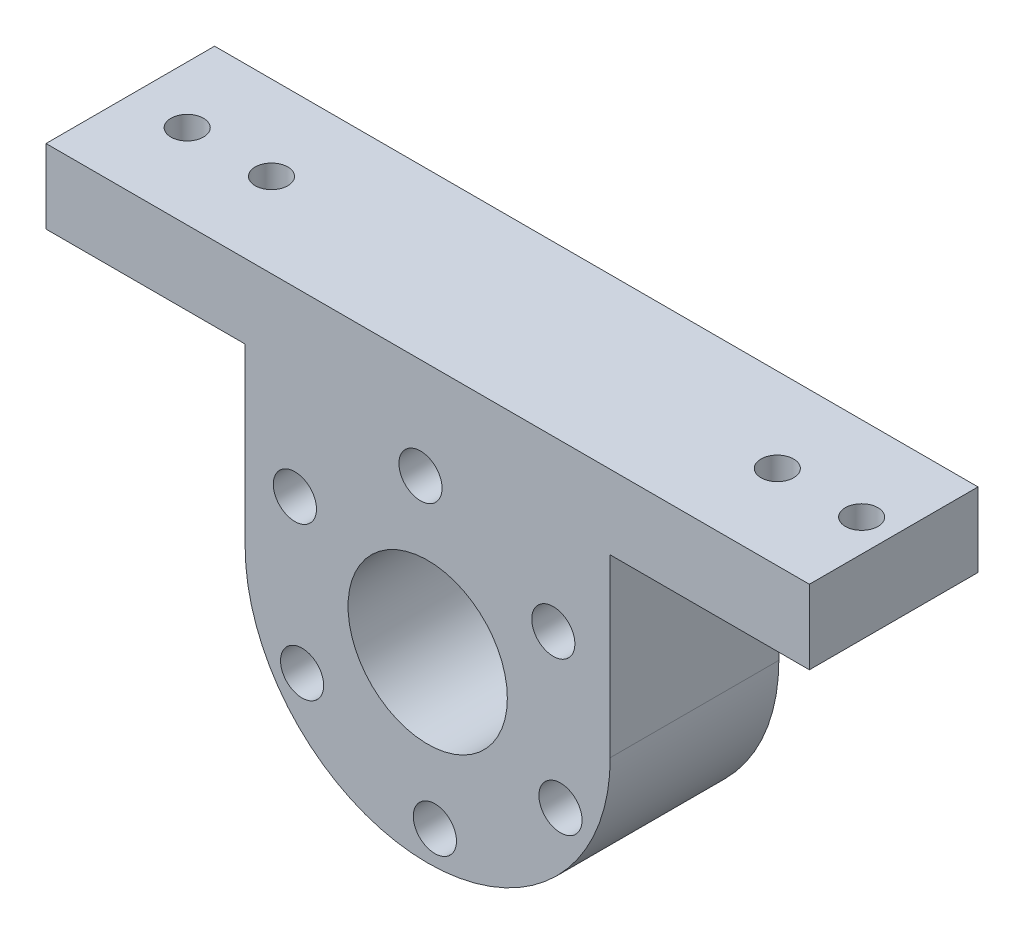
ISO-10303-21;
HEADER;
FILE_DESCRIPTION(('STEP AP214'),'2;1');
FILE_NAME('part.step','',(''),(''),'','','');
FILE_SCHEMA(('AUTOMOTIVE_DESIGN { 1 0 10303 214 1 1 1 1 }'));
ENDSEC;
DATA;
#1=APPLICATION_CONTEXT('core data for automotive mechanical design processes');
#2=APPLICATION_PROTOCOL_DEFINITION('international standard','automotive_design',2000,#1);
#3=PRODUCT_CONTEXT('',#1,'mechanical');
#4=PRODUCT('Part','Part','',(#3));
#5=PRODUCT_RELATED_PRODUCT_CATEGORY('part','',(#4));
#6=PRODUCT_DEFINITION_FORMATION('','',#4);
#7=PRODUCT_DEFINITION_CONTEXT('part definition',#1,'design');
#8=PRODUCT_DEFINITION('design','',#6,#7);
#9=PRODUCT_DEFINITION_SHAPE('','',#8);
#10=(LENGTH_UNIT() NAMED_UNIT(*) SI_UNIT(.MILLI.,.METRE.));
#11=(NAMED_UNIT(*) PLANE_ANGLE_UNIT() SI_UNIT($,.RADIAN.));
#12=(NAMED_UNIT(*) SI_UNIT($,.STERADIAN.) SOLID_ANGLE_UNIT());
#13=UNCERTAINTY_MEASURE_WITH_UNIT(LENGTH_MEASURE(1.E-05),#10,'distance_accuracy_value','');
#14=(GEOMETRIC_REPRESENTATION_CONTEXT(3) GLOBAL_UNCERTAINTY_ASSIGNED_CONTEXT((#13)) GLOBAL_UNIT_ASSIGNED_CONTEXT((#10,
#11,#12)) REPRESENTATION_CONTEXT('',''));
#15=CARTESIAN_POINT('',(0.,0.,0.));
#16=DIRECTION('',(0.,0.,1.));
#17=DIRECTION('',(1.,0.,0.));
#18=AXIS2_PLACEMENT_3D('',#15,#16,#17);
#19=CARTESIAN_POINT('',(0.,0.,25.4));
#20=DIRECTION('',(0.,1.,0.));
#21=DIRECTION('',(0.,0.,1.));
#22=AXIS2_PLACEMENT_3D('',#19,#20,#21);
#23=PLANE('',#22);
#24=CARTESIAN_POINT('',(-4.82999999999954,0.,12.7000000000003));
#25=DIRECTION('',(0.,1.,0.));
#26=DIRECTION('',(0.,0.,1.));
#27=AXIS2_PLACEMENT_3D('',#24,#25,#26);
#28=CIRCLE('',#27,2.45744999999999);
#29=CARTESIAN_POINT('',(-4.82999999999954,0.,15.1574500000003));
#30=VERTEX_POINT('',#29);
#31=EDGE_CURVE('E313',#30,#30,#28,.T.);
#32=ORIENTED_EDGE('',*,*,#31,.F.);
#33=EDGE_LOOP('',(#32));
#34=FACE_BOUND('',#33,.T.);
#35=CARTESIAN_POINT('',(-17.5299999999996,0.,12.7000000000003));
#36=DIRECTION('',(0.,1.,0.));
#37=DIRECTION('',(0.,0.,1.));
#38=AXIS2_PLACEMENT_3D('',#35,#36,#37);
#39=CIRCLE('',#38,2.45744999999999);
#40=CARTESIAN_POINT('',(-17.5299999999996,0.,15.1574500000003));
#41=VERTEX_POINT('',#40);
#42=EDGE_CURVE('E317',#41,#41,#39,.T.);
#43=ORIENTED_EDGE('',*,*,#42,.F.);
#44=EDGE_LOOP('',(#43));
#45=FACE_BOUND('',#44,.T.);
#46=CARTESIAN_POINT('',(-106.43,0.,12.7000000000003));
#47=DIRECTION('',(0.,1.,0.));
#48=DIRECTION('',(0.,0.,1.));
#49=AXIS2_PLACEMENT_3D('',#46,#47,#48);
#50=CIRCLE('',#49,2.45745);
#51=CARTESIAN_POINT('',(-106.43,0.,15.1574500000003));
#52=VERTEX_POINT('',#51);
#53=EDGE_CURVE('E312',#52,#52,#50,.T.);
#54=ORIENTED_EDGE('',*,*,#53,.F.);
#55=EDGE_LOOP('',(#54));
#56=FACE_BOUND('',#55,.T.);
#57=CARTESIAN_POINT('',(-93.7299999999995,0.,12.7000000000003));
#58=DIRECTION('',(0.,1.,0.));
#59=DIRECTION('',(0.,0.,1.));
#60=AXIS2_PLACEMENT_3D('',#57,#58,#59);
#61=CIRCLE('',#60,2.45744999999999);
#62=CARTESIAN_POINT('',(-93.7299999999995,0.,15.1574500000003));
#63=VERTEX_POINT('',#62);
#64=EDGE_CURVE('E265',#63,#63,#61,.T.);
#65=ORIENTED_EDGE('',*,*,#64,.F.);
#66=EDGE_LOOP('',(#65));
#67=FACE_BOUND('',#66,.T.);
#68=DIRECTION('',(1.,0.,0.));
#69=VECTOR('',#68,1.);
#70=CARTESIAN_POINT('',(0.,0.,0.));
#71=LINE('',#70,#69);
#72=CARTESIAN_POINT('',(-115.,0.,0.));
#73=VERTEX_POINT('',#72);
#74=CARTESIAN_POINT('',(0.,0.,0.));
#75=VERTEX_POINT('',#74);
#76=EDGE_CURVE('E190',#73,#75,#71,.T.);
#77=ORIENTED_EDGE('',*,*,#76,.F.);
#78=DIRECTION('',(0.,0.,-1.));
#79=VECTOR('',#78,1.);
#80=CARTESIAN_POINT('',(-115.,0.,25.4));
#81=LINE('',#80,#79);
#82=CARTESIAN_POINT('',(-115.,0.,25.4));
#83=VERTEX_POINT('',#82);
#84=EDGE_CURVE('E11',#83,#73,#81,.T.);
#85=ORIENTED_EDGE('',*,*,#84,.F.);
#86=DIRECTION('',(1.,0.,0.));
#87=VECTOR('',#86,1.);
#88=CARTESIAN_POINT('',(0.,0.,25.4));
#89=LINE('',#88,#87);
#90=CARTESIAN_POINT('',(0.,0.,25.4));
#91=VERTEX_POINT('',#90);
#92=EDGE_CURVE('E245',#83,#91,#89,.T.);
#93=ORIENTED_EDGE('',*,*,#92,.T.);
#94=DIRECTION('',(0.,0.,-1.));
#95=VECTOR('',#94,1.);
#96=CARTESIAN_POINT('',(0.,0.,25.4));
#97=LINE('',#96,#95);
#98=EDGE_CURVE('E110',#91,#75,#97,.T.);
#99=ORIENTED_EDGE('',*,*,#98,.T.);
#100=EDGE_LOOP('',(#77,#85,#93,#99));
#101=FACE_BOUND('',#100,.T.);
#102=ADVANCED_FACE('F50',(#34,#45,#56,#67,#101),#23,.T.);
#103=CARTESIAN_POINT('',(-115.,0.,25.4));
#104=DIRECTION('',(-1.,0.,0.));
#105=DIRECTION('',(0.,0.,1.));
#106=AXIS2_PLACEMENT_3D('',#103,#104,#105);
#107=PLANE('',#106);
#108=DIRECTION('',(0.,1.,0.));
#109=VECTOR('',#108,1.);
#110=CARTESIAN_POINT('',(-115.,0.,0.));
#111=LINE('',#110,#109);
#112=CARTESIAN_POINT('',(-115.,-11.1674868933549,0.));
#113=VERTEX_POINT('',#112);
#114=EDGE_CURVE('E194',#113,#73,#111,.T.);
#115=ORIENTED_EDGE('',*,*,#114,.F.);
#116=DIRECTION('',(0.,0.,-1.));
#117=VECTOR('',#116,1.);
#118=CARTESIAN_POINT('',(-115.,-11.1674868933549,25.4));
#119=LINE('',#118,#117);
#120=CARTESIAN_POINT('',(-115.,-11.1674868933549,25.4));
#121=VERTEX_POINT('',#120);
#122=EDGE_CURVE('E60',#121,#113,#119,.T.);
#123=ORIENTED_EDGE('',*,*,#122,.F.);
#124=DIRECTION('',(0.,1.,0.));
#125=VECTOR('',#124,1.);
#126=CARTESIAN_POINT('',(-115.,0.,25.4));
#127=LINE('',#126,#125);
#128=EDGE_CURVE('E301',#121,#83,#127,.T.);
#129=ORIENTED_EDGE('',*,*,#128,.T.);
#130=ORIENTED_EDGE('',*,*,#84,.T.);
#131=EDGE_LOOP('',(#115,#123,#129,#130));
#132=FACE_BOUND('',#131,.T.);
#133=ADVANCED_FACE('F284',(#132),#107,.T.);
#134=CARTESIAN_POINT('',(0.,-11.1674868933545,25.4));
#135=DIRECTION('',(0.,-1.,0.));
#136=DIRECTION('',(1.,0.,0.));
#137=AXIS2_PLACEMENT_3D('',#134,#135,#136);
#138=PLANE('',#137);
#139=CARTESIAN_POINT('',(-106.43,-11.1674868933549,12.7000000000003));
#140=DIRECTION('',(0.,-1.,0.));
#141=DIRECTION('',(1.,0.,0.));
#142=AXIS2_PLACEMENT_3D('',#139,#140,#141);
#143=CIRCLE('',#142,2.45745);
#144=CARTESIAN_POINT('',(-103.97255,-11.1674868933549,12.7000000000003));
#145=VERTEX_POINT('',#144);
#146=EDGE_CURVE('E53',#145,#145,#143,.T.);
#147=ORIENTED_EDGE('',*,*,#146,.F.);
#148=EDGE_LOOP('',(#147));
#149=FACE_BOUND('',#148,.T.);
#150=CARTESIAN_POINT('',(-93.7299999999995,-11.1674868933548,12.7000000000003));
#151=DIRECTION('',(0.,-1.,0.));
#152=DIRECTION('',(1.,0.,0.));
#153=AXIS2_PLACEMENT_3D('',#150,#151,#152);
#154=CIRCLE('',#153,2.45744999999999);
#155=CARTESIAN_POINT('',(-91.2725499999996,-11.1674868933548,12.7000000000003));
#156=VERTEX_POINT('',#155);
#157=EDGE_CURVE('E268',#156,#156,#154,.T.);
#158=ORIENTED_EDGE('',*,*,#157,.F.);
#159=EDGE_LOOP('',(#158));
#160=FACE_BOUND('',#159,.T.);
#161=DIRECTION('',(-1.,0.,0.));
#162=VECTOR('',#161,1.);
#163=CARTESIAN_POINT('',(0.,-11.1674868933545,0.));
#164=LINE('',#163,#162);
#165=CARTESIAN_POINT('',(-85.0000000000002,-11.1674868933548,0.));
#166=VERTEX_POINT('',#165);
#167=EDGE_CURVE('E198',#166,#113,#164,.T.);
#168=ORIENTED_EDGE('',*,*,#167,.F.);
#169=DIRECTION('',(0.,0.,-1.));
#170=VECTOR('',#169,1.);
#171=CARTESIAN_POINT('',(-85.0000000000002,-11.1674868933548,25.4));
#172=LINE('',#171,#170);
#173=CARTESIAN_POINT('',(-85.0000000000002,-11.1674868933548,25.4));
#174=VERTEX_POINT('',#173);
#175=EDGE_CURVE('E255',#174,#166,#172,.T.);
#176=ORIENTED_EDGE('',*,*,#175,.F.);
#177=DIRECTION('',(-1.,0.,0.));
#178=VECTOR('',#177,1.);
#179=CARTESIAN_POINT('',(0.,-11.1674868933545,25.4));
#180=LINE('',#179,#178);
#181=EDGE_CURVE('E299',#174,#121,#180,.T.);
#182=ORIENTED_EDGE('',*,*,#181,.T.);
#183=ORIENTED_EDGE('',*,*,#122,.T.);
#184=EDGE_LOOP('',(#168,#176,#182,#183));
#185=FACE_BOUND('',#184,.T.);
#186=ADVANCED_FACE('F280',(#149,#160,#185),#138,.T.);
#187=CARTESIAN_POINT('',(-85.0000000000002,0.,25.4));
#188=DIRECTION('',(-1.,0.,0.));
#189=DIRECTION('',(0.,0.,1.));
#190=AXIS2_PLACEMENT_3D('',#187,#188,#189);
#191=PLANE('',#190);
#192=DIRECTION('',(0.,1.,0.));
#193=VECTOR('',#192,1.);
#194=CARTESIAN_POINT('',(-85.0000000000002,0.,0.));
#195=LINE('',#194,#193);
#196=CARTESIAN_POINT('',(-85.0000000000002,-37.625000004001,0.));
#197=VERTEX_POINT('',#196);
#198=EDGE_CURVE('E202',#197,#166,#195,.T.);
#199=ORIENTED_EDGE('',*,*,#198,.F.);
#200=DIRECTION('',(0.,0.,-1.));
#201=VECTOR('',#200,1.);
#202=CARTESIAN_POINT('',(-85.0000000000002,-37.625000004001,25.4));
#203=LINE('',#202,#201);
#204=CARTESIAN_POINT('',(-85.0000000000002,-37.625000004001,25.4));
#205=VERTEX_POINT('',#204);
#206=EDGE_CURVE('E252',#205,#197,#203,.T.);
#207=ORIENTED_EDGE('',*,*,#206,.F.);
#208=DIRECTION('',(0.,1.,0.));
#209=VECTOR('',#208,1.);
#210=CARTESIAN_POINT('',(-85.0000000000002,0.,25.4));
#211=LINE('',#210,#209);
#212=EDGE_CURVE('E156',#205,#174,#211,.T.);
#213=ORIENTED_EDGE('',*,*,#212,.T.);
#214=ORIENTED_EDGE('',*,*,#175,.T.);
#215=EDGE_LOOP('',(#199,#207,#213,#214));
#216=FACE_BOUND('',#215,.T.);
#217=ADVANCED_FACE('F283',(#216),#191,.T.);
#218=CARTESIAN_POINT('',(-57.5000000000001,-37.625000004001,25.4));
#219=DIRECTION('',(0.,0.,-1.));
#220=DIRECTION('',(-1.,0.,0.));
#221=AXIS2_PLACEMENT_3D('',#218,#219,#220);
#222=CYLINDRICAL_SURFACE('',#221,27.5);
#223=CARTESIAN_POINT('',(-57.5000000000001,-37.625000004001,0.));
#224=DIRECTION('',(0.,0.,1.));
#225=DIRECTION('',(1.,0.,0.));
#226=AXIS2_PLACEMENT_3D('',#223,#224,#225);
#227=CIRCLE('',#226,27.5);
#228=CARTESIAN_POINT('',(-30.,-37.625000004001,0.));
#229=VERTEX_POINT('',#228);
#230=EDGE_CURVE('E206',#197,#229,#227,.T.);
#231=ORIENTED_EDGE('',*,*,#230,.T.);
#232=DIRECTION('',(0.,0.,-1.));
#233=VECTOR('',#232,1.);
#234=CARTESIAN_POINT('',(-30.,-37.625000004001,25.4));
#235=LINE('',#234,#233);
#236=CARTESIAN_POINT('',(-30.,-37.625000004001,25.4));
#237=VERTEX_POINT('',#236);
#238=EDGE_CURVE('E140',#237,#229,#235,.T.);
#239=ORIENTED_EDGE('',*,*,#238,.F.);
#240=CARTESIAN_POINT('',(-57.5000000000001,-37.625000004001,25.4));
#241=DIRECTION('',(0.,0.,1.));
#242=DIRECTION('',(1.,0.,0.));
#243=AXIS2_PLACEMENT_3D('',#240,#241,#242);
#244=CIRCLE('',#243,27.5);
#245=EDGE_CURVE('E151',#205,#237,#244,.T.);
#246=ORIENTED_EDGE('',*,*,#245,.F.);
#247=ORIENTED_EDGE('',*,*,#206,.T.);
#248=EDGE_LOOP('',(#231,#239,#246,#247));
#249=FACE_BOUND('',#248,.T.);
#250=ADVANCED_FACE('F338',(#249),#222,.T.);
#251=CARTESIAN_POINT('',(-30.,0.,25.4));
#252=DIRECTION('',(1.,0.,0.));
#253=DIRECTION('',(0.,0.,-1.));
#254=AXIS2_PLACEMENT_3D('',#251,#252,#253);
#255=PLANE('',#254);
#256=DIRECTION('',(0.,-1.,0.));
#257=VECTOR('',#256,1.);
#258=CARTESIAN_POINT('',(-30.,0.,0.));
#259=LINE('',#258,#257);
#260=CARTESIAN_POINT('',(-30.,-11.1674868933548,0.));
#261=VERTEX_POINT('',#260);
#262=EDGE_CURVE('E138',#261,#229,#259,.T.);
#263=ORIENTED_EDGE('',*,*,#262,.F.);
#264=DIRECTION('',(0.,0.,-1.));
#265=VECTOR('',#264,1.);
#266=CARTESIAN_POINT('',(-30.,-11.1674868933548,25.4));
#267=LINE('',#266,#265);
#268=CARTESIAN_POINT('',(-30.,-11.1674868933548,25.4));
#269=VERTEX_POINT('',#268);
#270=EDGE_CURVE('E132',#269,#261,#267,.T.);
#271=ORIENTED_EDGE('',*,*,#270,.F.);
#272=DIRECTION('',(0.,-1.,0.));
#273=VECTOR('',#272,1.);
#274=CARTESIAN_POINT('',(-30.,0.,25.4));
#275=LINE('',#274,#273);
#276=EDGE_CURVE('E136',#269,#237,#275,.T.);
#277=ORIENTED_EDGE('',*,*,#276,.T.);
#278=ORIENTED_EDGE('',*,*,#238,.T.);
#279=EDGE_LOOP('',(#263,#271,#277,#278));
#280=FACE_BOUND('',#279,.T.);
#281=ADVANCED_FACE('F134',(#280),#255,.T.);
#282=CARTESIAN_POINT('',(0.,-11.1674868933549,25.4));
#283=DIRECTION('',(0.,1.,0.));
#284=DIRECTION('',(-1.,0.,0.));
#285=AXIS2_PLACEMENT_3D('',#282,#283,#284);
#286=PLANE('',#285);
#287=CARTESIAN_POINT('',(-4.82999999999954,-11.1674868933549,12.7000000000003));
#288=DIRECTION('',(0.,1.,0.));
#289=DIRECTION('',(-1.,0.,0.));
#290=AXIS2_PLACEMENT_3D('',#287,#288,#289);
#291=CIRCLE('',#290,2.45744999999999);
#292=CARTESIAN_POINT('',(-7.28744999999953,-11.1674868933549,12.7000000000003));
#293=VERTEX_POINT('',#292);
#294=EDGE_CURVE('E264',#293,#293,#291,.T.);
#295=ORIENTED_EDGE('',*,*,#294,.T.);
#296=EDGE_LOOP('',(#295));
#297=FACE_BOUND('',#296,.T.);
#298=CARTESIAN_POINT('',(-17.5299999999996,-11.1674868933548,12.7000000000003));
#299=DIRECTION('',(0.,1.,0.));
#300=DIRECTION('',(-1.,0.,0.));
#301=AXIS2_PLACEMENT_3D('',#298,#299,#300);
#302=CIRCLE('',#301,2.45744999999999);
#303=CARTESIAN_POINT('',(-19.9874499999995,-11.1674868933548,12.7000000000003));
#304=VERTEX_POINT('',#303);
#305=EDGE_CURVE('E260',#304,#304,#302,.T.);
#306=ORIENTED_EDGE('',*,*,#305,.T.);
#307=EDGE_LOOP('',(#306));
#308=FACE_BOUND('',#307,.T.);
#309=DIRECTION('',(1.,0.,0.));
#310=VECTOR('',#309,1.);
#311=CARTESIAN_POINT('',(0.,-11.1674868933549,0.));
#312=LINE('',#311,#310);
#313=CARTESIAN_POINT('',(0.,-11.1674868933549,0.));
#314=VERTEX_POINT('',#313);
#315=EDGE_CURVE('E103',#261,#314,#312,.T.);
#316=ORIENTED_EDGE('',*,*,#315,.T.);
#317=DIRECTION('',(0.,0.,-1.));
#318=VECTOR('',#317,1.);
#319=CARTESIAN_POINT('',(0.,-11.1674868933549,25.4));
#320=LINE('',#319,#318);
#321=CARTESIAN_POINT('',(0.,-11.1674868933549,25.4));
#322=VERTEX_POINT('',#321);
#323=EDGE_CURVE('E141',#322,#314,#320,.T.);
#324=ORIENTED_EDGE('',*,*,#323,.F.);
#325=DIRECTION('',(1.,0.,0.));
#326=VECTOR('',#325,1.);
#327=CARTESIAN_POINT('',(0.,-11.1674868933549,25.4));
#328=LINE('',#327,#326);
#329=EDGE_CURVE('E143',#269,#322,#328,.T.);
#330=ORIENTED_EDGE('',*,*,#329,.F.);
#331=ORIENTED_EDGE('',*,*,#270,.T.);
#332=EDGE_LOOP('',(#316,#324,#330,#331));
#333=FACE_BOUND('',#332,.T.);
#334=ADVANCED_FACE('F144',(#297,#308,#333),#286,.F.);
#335=CARTESIAN_POINT('',(-77.504530256097,-27.3260306753299,25.4));
#336=DIRECTION('',(0.,0.,-1.));
#337=DIRECTION('',(-1.,0.,0.));
#338=AXIS2_PLACEMENT_3D('',#335,#336,#337);
#339=CYLINDRICAL_SURFACE('',#338,3.24999999999994);
#340=CARTESIAN_POINT('',(-77.504530256097,-27.3260306753299,25.4));
#341=DIRECTION('',(0.,0.,1.));
#342=DIRECTION('',(1.,0.,0.));
#343=AXIS2_PLACEMENT_3D('',#340,#341,#342);
#344=CIRCLE('',#343,3.24999999999994);
#345=CARTESIAN_POINT('',(-74.2545302560971,-27.3260306753299,25.4));
#346=VERTEX_POINT('',#345);
#347=EDGE_CURVE('E182',#346,#346,#344,.T.);
#348=ORIENTED_EDGE('',*,*,#347,.T.);
#349=EDGE_LOOP('',(#348));
#350=FACE_BOUND('',#349,.T.);
#351=CARTESIAN_POINT('',(-77.504530256097,-27.3260306753299,0.));
#352=DIRECTION('',(0.,0.,1.));
#353=DIRECTION('',(1.,0.,0.));
#354=AXIS2_PLACEMENT_3D('',#351,#352,#353);
#355=CIRCLE('',#354,3.24999999999994);
#356=CARTESIAN_POINT('',(-74.2545302560971,-27.3260306753299,0.));
#357=VERTEX_POINT('',#356);
#358=EDGE_CURVE('E237',#357,#357,#355,.T.);
#359=ORIENTED_EDGE('',*,*,#358,.F.);
#360=EDGE_LOOP('',(#359));
#361=FACE_BOUND('',#360,.T.);
#362=ADVANCED_FACE('F346',(#350,#361),#339,.F.);
#363=CARTESIAN_POINT('',(-76.4214341994743,-49.7999467322199,25.4));
#364=DIRECTION('',(0.,0.,-1.));
#365=DIRECTION('',(-1.,0.,0.));
#366=AXIS2_PLACEMENT_3D('',#363,#364,#365);
#367=CYLINDRICAL_SURFACE('',#366,3.25000000000007);
#368=CARTESIAN_POINT('',(-76.4214341994743,-49.7999467322199,25.4));
#369=DIRECTION('',(0.,0.,1.));
#370=DIRECTION('',(1.,0.,0.));
#371=AXIS2_PLACEMENT_3D('',#368,#369,#370);
#372=CIRCLE('',#371,3.25000000000007);
#373=CARTESIAN_POINT('',(-73.1714341994743,-49.7999467322199,25.4));
#374=VERTEX_POINT('',#373);
#375=EDGE_CURVE('E178',#374,#374,#372,.T.);
#376=ORIENTED_EDGE('',*,*,#375,.T.);
#377=EDGE_LOOP('',(#376));
#378=FACE_BOUND('',#377,.T.);
#379=CARTESIAN_POINT('',(-76.4214341994743,-49.7999467322199,0.));
#380=DIRECTION('',(0.,0.,1.));
#381=DIRECTION('',(1.,0.,0.));
#382=AXIS2_PLACEMENT_3D('',#379,#380,#381);
#383=CIRCLE('',#382,3.25000000000007);
#384=CARTESIAN_POINT('',(-73.1714341994743,-49.7999467322199,0.));
#385=VERTEX_POINT('',#384);
#386=EDGE_CURVE('E233',#385,#385,#383,.T.);
#387=ORIENTED_EDGE('',*,*,#386,.F.);
#388=EDGE_LOOP('',(#387));
#389=FACE_BOUND('',#388,.T.);
#390=ADVANCED_FACE('F368',(#378,#389),#367,.F.);
#391=CARTESIAN_POINT('',(-56.4169039433773,-60.0989160608908,25.4));
#392=DIRECTION('',(0.,0.,-1.));
#393=DIRECTION('',(-1.,0.,0.));
#394=AXIS2_PLACEMENT_3D('',#391,#392,#393);
#395=CYLINDRICAL_SURFACE('',#394,3.24999999999994);
#396=CARTESIAN_POINT('',(-56.4169039433773,-60.0989160608908,25.4));
#397=DIRECTION('',(0.,0.,1.));
#398=DIRECTION('',(1.,0.,0.));
#399=AXIS2_PLACEMENT_3D('',#396,#397,#398);
#400=CIRCLE('',#399,3.24999999999994);
#401=CARTESIAN_POINT('',(-53.1669039433773,-60.0989160608908,25.4));
#402=VERTEX_POINT('',#401);
#403=EDGE_CURVE('E174',#402,#402,#400,.T.);
#404=ORIENTED_EDGE('',*,*,#403,.T.);
#405=EDGE_LOOP('',(#404));
#406=FACE_BOUND('',#405,.T.);
#407=CARTESIAN_POINT('',(-56.4169039433773,-60.0989160608908,0.));
#408=DIRECTION('',(0.,0.,1.));
#409=DIRECTION('',(1.,0.,0.));
#410=AXIS2_PLACEMENT_3D('',#407,#408,#409);
#411=CIRCLE('',#410,3.24999999999994);
#412=CARTESIAN_POINT('',(-53.1669039433773,-60.0989160608908,0.));
#413=VERTEX_POINT('',#412);
#414=EDGE_CURVE('E229',#413,#413,#411,.T.);
#415=ORIENTED_EDGE('',*,*,#414,.F.);
#416=EDGE_LOOP('',(#415));
#417=FACE_BOUND('',#416,.T.);
#418=ADVANCED_FACE('F364',(#406,#417),#395,.F.);
#419=CARTESIAN_POINT('',(-37.4954697439032,-47.923969332672,25.4));
#420=DIRECTION('',(0.,0.,-1.));
#421=DIRECTION('',(-1.,0.,0.));
#422=AXIS2_PLACEMENT_3D('',#419,#420,#421);
#423=CYLINDRICAL_SURFACE('',#422,3.24999999999994);
#424=CARTESIAN_POINT('',(-37.4954697439032,-47.923969332672,25.4));
#425=DIRECTION('',(0.,0.,1.));
#426=DIRECTION('',(1.,0.,0.));
#427=AXIS2_PLACEMENT_3D('',#424,#425,#426);
#428=CIRCLE('',#427,3.24999999999994);
#429=CARTESIAN_POINT('',(-34.2454697439032,-47.923969332672,25.4));
#430=VERTEX_POINT('',#429);
#431=EDGE_CURVE('E170',#430,#430,#428,.T.);
#432=ORIENTED_EDGE('',*,*,#431,.T.);
#433=EDGE_LOOP('',(#432));
#434=FACE_BOUND('',#433,.T.);
#435=CARTESIAN_POINT('',(-37.4954697439032,-47.923969332672,0.));
#436=DIRECTION('',(0.,0.,1.));
#437=DIRECTION('',(1.,0.,0.));
#438=AXIS2_PLACEMENT_3D('',#435,#436,#437);
#439=CIRCLE('',#438,3.24999999999994);
#440=CARTESIAN_POINT('',(-34.2454697439032,-47.923969332672,0.));
#441=VERTEX_POINT('',#440);
#442=EDGE_CURVE('E225',#441,#441,#439,.T.);
#443=ORIENTED_EDGE('',*,*,#442,.F.);
#444=EDGE_LOOP('',(#443));
#445=FACE_BOUND('',#444,.T.);
#446=ADVANCED_FACE('F360',(#434,#445),#423,.F.);
#447=CARTESIAN_POINT('',(-38.5785658005259,-25.450053275782,25.4));
#448=DIRECTION('',(0.,0.,-1.));
#449=DIRECTION('',(-1.,0.,0.));
#450=AXIS2_PLACEMENT_3D('',#447,#448,#449);
#451=CYLINDRICAL_SURFACE('',#450,3.24999999999994);
#452=CARTESIAN_POINT('',(-38.5785658005259,-25.450053275782,25.4));
#453=DIRECTION('',(0.,0.,1.));
#454=DIRECTION('',(1.,0.,0.));
#455=AXIS2_PLACEMENT_3D('',#452,#453,#454);
#456=CIRCLE('',#455,3.24999999999994);
#457=CARTESIAN_POINT('',(-35.3285658005259,-25.450053275782,25.4));
#458=VERTEX_POINT('',#457);
#459=EDGE_CURVE('E166',#458,#458,#456,.T.);
#460=ORIENTED_EDGE('',*,*,#459,.T.);
#461=EDGE_LOOP('',(#460));
#462=FACE_BOUND('',#461,.T.);
#463=CARTESIAN_POINT('',(-38.5785658005259,-25.450053275782,0.));
#464=DIRECTION('',(0.,0.,1.));
#465=DIRECTION('',(1.,0.,0.));
#466=AXIS2_PLACEMENT_3D('',#463,#464,#465);
#467=CIRCLE('',#466,3.24999999999994);
#468=CARTESIAN_POINT('',(-35.3285658005259,-25.450053275782,0.));
#469=VERTEX_POINT('',#468);
#470=EDGE_CURVE('E221',#469,#469,#467,.T.);
#471=ORIENTED_EDGE('',*,*,#470,.F.);
#472=EDGE_LOOP('',(#471));
#473=FACE_BOUND('',#472,.T.);
#474=ADVANCED_FACE('F356',(#462,#473),#451,.F.);
#475=CARTESIAN_POINT('',(-58.5830960566229,-15.1510839471111,25.4));
#476=DIRECTION('',(0.,0.,-1.));
#477=DIRECTION('',(-1.,0.,0.));
#478=AXIS2_PLACEMENT_3D('',#475,#476,#477);
#479=CYLINDRICAL_SURFACE('',#478,3.25000000000008);
#480=CARTESIAN_POINT('',(-58.5830960566229,-15.1510839471111,25.4));
#481=DIRECTION('',(0.,0.,1.));
#482=DIRECTION('',(1.,0.,0.));
#483=AXIS2_PLACEMENT_3D('',#480,#481,#482);
#484=CIRCLE('',#483,3.25000000000008);
#485=CARTESIAN_POINT('',(-55.3330960566228,-15.1510839471111,25.4));
#486=VERTEX_POINT('',#485);
#487=EDGE_CURVE('E162',#486,#486,#484,.T.);
#488=ORIENTED_EDGE('',*,*,#487,.T.);
#489=EDGE_LOOP('',(#488));
#490=FACE_BOUND('',#489,.T.);
#491=CARTESIAN_POINT('',(-58.5830960566229,-15.1510839471111,0.));
#492=DIRECTION('',(0.,0.,1.));
#493=DIRECTION('',(1.,0.,0.));
#494=AXIS2_PLACEMENT_3D('',#491,#492,#493);
#495=CIRCLE('',#494,3.25000000000008);
#496=CARTESIAN_POINT('',(-55.3330960566228,-15.1510839471111,0.));
#497=VERTEX_POINT('',#496);
#498=EDGE_CURVE('E217',#497,#497,#495,.T.);
#499=ORIENTED_EDGE('',*,*,#498,.F.);
#500=EDGE_LOOP('',(#499));
#501=FACE_BOUND('',#500,.T.);
#502=ADVANCED_FACE('F352',(#490,#501),#479,.F.);
#503=CARTESIAN_POINT('',(0.,0.,25.4));
#504=DIRECTION('',(-1.,0.,0.));
#505=DIRECTION('',(0.,0.,1.));
#506=AXIS2_PLACEMENT_3D('',#503,#504,#505);
#507=PLANE('',#506);
#508=DIRECTION('',(0.,1.,0.));
#509=VECTOR('',#508,1.);
#510=CARTESIAN_POINT('',(0.,0.,0.));
#511=LINE('',#510,#509);
#512=EDGE_CURVE('E214',#314,#75,#511,.T.);
#513=ORIENTED_EDGE('',*,*,#512,.T.);
#514=ORIENTED_EDGE('',*,*,#98,.F.);
#515=DIRECTION('',(0.,1.,0.));
#516=VECTOR('',#515,1.);
#517=CARTESIAN_POINT('',(0.,0.,25.4));
#518=LINE('',#517,#516);
#519=EDGE_CURVE('E69',#322,#91,#518,.T.);
#520=ORIENTED_EDGE('',*,*,#519,.F.);
#521=ORIENTED_EDGE('',*,*,#323,.T.);
#522=EDGE_LOOP('',(#513,#514,#520,#521));
#523=FACE_BOUND('',#522,.T.);
#524=ADVANCED_FACE('F348',(#523),#507,.F.);
#525=CARTESIAN_POINT('',(-57.5000000000001,-37.625000004001,25.4));
#526=DIRECTION('',(0.,0.,-1.));
#527=DIRECTION('',(-1.,0.,0.));
#528=AXIS2_PLACEMENT_3D('',#525,#526,#527);
#529=CYLINDRICAL_SURFACE('',#528,12.);
#530=CARTESIAN_POINT('',(-57.5000000000001,-37.625000004001,25.4));
#531=DIRECTION('',(0.,0.,1.));
#532=DIRECTION('',(1.,0.,0.));
#533=AXIS2_PLACEMENT_3D('',#530,#531,#532);
#534=CIRCLE('',#533,12.);
#535=CARTESIAN_POINT('',(-45.5000000000001,-37.625000004001,25.4));
#536=VERTEX_POINT('',#535);
#537=EDGE_CURVE('E186',#536,#536,#534,.T.);
#538=ORIENTED_EDGE('',*,*,#537,.T.);
#539=EDGE_LOOP('',(#538));
#540=FACE_BOUND('',#539,.T.);
#541=CARTESIAN_POINT('',(-57.5000000000001,-37.625000004001,0.));
#542=DIRECTION('',(0.,0.,1.));
#543=DIRECTION('',(1.,0.,0.));
#544=AXIS2_PLACEMENT_3D('',#541,#542,#543);
#545=CIRCLE('',#544,12.);
#546=CARTESIAN_POINT('',(-45.5000000000001,-37.625000004001,0.));
#547=VERTEX_POINT('',#546);
#548=EDGE_CURVE('E241',#547,#547,#545,.T.);
#549=ORIENTED_EDGE('',*,*,#548,.F.);
#550=EDGE_LOOP('',(#549));
#551=FACE_BOUND('',#550,.T.);
#552=ADVANCED_FACE('F351',(#540,#551),#529,.F.);
#553=CARTESIAN_POINT('',(0.,0.,25.4));
#554=DIRECTION('',(0.,0.,1.));
#555=DIRECTION('',(1.,0.,0.));
#556=AXIS2_PLACEMENT_3D('',#553,#554,#555);
#557=PLANE('',#556);
#558=ORIENTED_EDGE('',*,*,#92,.F.);
#559=ORIENTED_EDGE('',*,*,#128,.F.);
#560=ORIENTED_EDGE('',*,*,#181,.F.);
#561=ORIENTED_EDGE('',*,*,#212,.F.);
#562=ORIENTED_EDGE('',*,*,#245,.T.);
#563=ORIENTED_EDGE('',*,*,#276,.F.);
#564=ORIENTED_EDGE('',*,*,#329,.T.);
#565=ORIENTED_EDGE('',*,*,#519,.T.);
#566=EDGE_LOOP('',(#558,#559,#560,#561,#562,#563,#564,#565));
#567=FACE_BOUND('',#566,.T.);
#568=ORIENTED_EDGE('',*,*,#487,.F.);
#569=EDGE_LOOP('',(#568));
#570=FACE_BOUND('',#569,.T.);
#571=ORIENTED_EDGE('',*,*,#459,.F.);
#572=EDGE_LOOP('',(#571));
#573=FACE_BOUND('',#572,.T.);
#574=ORIENTED_EDGE('',*,*,#431,.F.);
#575=EDGE_LOOP('',(#574));
#576=FACE_BOUND('',#575,.T.);
#577=ORIENTED_EDGE('',*,*,#403,.F.);
#578=EDGE_LOOP('',(#577));
#579=FACE_BOUND('',#578,.T.);
#580=ORIENTED_EDGE('',*,*,#375,.F.);
#581=EDGE_LOOP('',(#580));
#582=FACE_BOUND('',#581,.T.);
#583=ORIENTED_EDGE('',*,*,#347,.F.);
#584=EDGE_LOOP('',(#583));
#585=FACE_BOUND('',#584,.T.);
#586=ORIENTED_EDGE('',*,*,#537,.F.);
#587=EDGE_LOOP('',(#586));
#588=FACE_BOUND('',#587,.T.);
#589=ADVANCED_FACE('F147',(#567,#570,#573,#576,#579,#582,#585,#588),#557,.T.);
#590=CARTESIAN_POINT('',(0.,0.,0.));
#591=DIRECTION('',(0.,0.,1.));
#592=DIRECTION('',(1.,0.,0.));
#593=AXIS2_PLACEMENT_3D('',#590,#591,#592);
#594=PLANE('',#593);
#595=ORIENTED_EDGE('',*,*,#76,.T.);
#596=ORIENTED_EDGE('',*,*,#512,.F.);
#597=ORIENTED_EDGE('',*,*,#315,.F.);
#598=ORIENTED_EDGE('',*,*,#262,.T.);
#599=ORIENTED_EDGE('',*,*,#230,.F.);
#600=ORIENTED_EDGE('',*,*,#198,.T.);
#601=ORIENTED_EDGE('',*,*,#167,.T.);
#602=ORIENTED_EDGE('',*,*,#114,.T.);
#603=EDGE_LOOP('',(#595,#596,#597,#598,#599,#600,#601,#602));
#604=FACE_BOUND('',#603,.T.);
#605=ORIENTED_EDGE('',*,*,#498,.T.);
#606=EDGE_LOOP('',(#605));
#607=FACE_BOUND('',#606,.T.);
#608=ORIENTED_EDGE('',*,*,#470,.T.);
#609=EDGE_LOOP('',(#608));
#610=FACE_BOUND('',#609,.T.);
#611=ORIENTED_EDGE('',*,*,#442,.T.);
#612=EDGE_LOOP('',(#611));
#613=FACE_BOUND('',#612,.T.);
#614=ORIENTED_EDGE('',*,*,#414,.T.);
#615=EDGE_LOOP('',(#614));
#616=FACE_BOUND('',#615,.T.);
#617=ORIENTED_EDGE('',*,*,#386,.T.);
#618=EDGE_LOOP('',(#617));
#619=FACE_BOUND('',#618,.T.);
#620=ORIENTED_EDGE('',*,*,#358,.T.);
#621=EDGE_LOOP('',(#620));
#622=FACE_BOUND('',#621,.T.);
#623=ORIENTED_EDGE('',*,*,#548,.T.);
#624=EDGE_LOOP('',(#623));
#625=FACE_BOUND('',#624,.T.);
#626=ADVANCED_FACE('F294',(#604,#607,#610,#613,#616,#619,#622,#625),#594,.F.);
#627=CARTESIAN_POINT('',(-17.5299999999996,-31.,12.7000000000003));
#628=DIRECTION('',(0.,1.,0.));
#629=DIRECTION('',(0.,0.,1.));
#630=AXIS2_PLACEMENT_3D('',#627,#628,#629);
#631=CYLINDRICAL_SURFACE('',#630,2.45744999999999);
#632=ORIENTED_EDGE('',*,*,#42,.T.);
#633=EDGE_LOOP('',(#632));
#634=FACE_BOUND('',#633,.T.);
#635=ORIENTED_EDGE('',*,*,#305,.F.);
#636=EDGE_LOOP('',(#635));
#637=FACE_BOUND('',#636,.T.);
#638=ADVANCED_FACE('F381',(#634,#637),#631,.F.);
#639=CARTESIAN_POINT('',(-4.82999999999954,-31.,12.7000000000003));
#640=DIRECTION('',(0.,1.,0.));
#641=DIRECTION('',(0.,0.,1.));
#642=AXIS2_PLACEMENT_3D('',#639,#640,#641);
#643=CYLINDRICAL_SURFACE('',#642,2.45744999999999);
#644=ORIENTED_EDGE('',*,*,#31,.T.);
#645=EDGE_LOOP('',(#644));
#646=FACE_BOUND('',#645,.T.);
#647=ORIENTED_EDGE('',*,*,#294,.F.);
#648=EDGE_LOOP('',(#647));
#649=FACE_BOUND('',#648,.T.);
#650=ADVANCED_FACE('F386',(#646,#649),#643,.F.);
#651=CARTESIAN_POINT('',(-93.7299999999995,-31.,12.7000000000003));
#652=DIRECTION('',(0.,1.,0.));
#653=DIRECTION('',(0.,0.,1.));
#654=AXIS2_PLACEMENT_3D('',#651,#652,#653);
#655=CYLINDRICAL_SURFACE('',#654,2.45744999999999);
#656=ORIENTED_EDGE('',*,*,#157,.T.);
#657=EDGE_LOOP('',(#656));
#658=FACE_BOUND('',#657,.T.);
#659=ORIENTED_EDGE('',*,*,#64,.T.);
#660=EDGE_LOOP('',(#659));
#661=FACE_BOUND('',#660,.T.);
#662=ADVANCED_FACE('F383',(#658,#661),#655,.F.);
#663=CARTESIAN_POINT('',(-106.43,-31.,12.7000000000003));
#664=DIRECTION('',(0.,1.,0.));
#665=DIRECTION('',(0.,0.,1.));
#666=AXIS2_PLACEMENT_3D('',#663,#664,#665);
#667=CYLINDRICAL_SURFACE('',#666,2.45745);
#668=ORIENTED_EDGE('',*,*,#146,.T.);
#669=EDGE_LOOP('',(#668));
#670=FACE_BOUND('',#669,.T.);
#671=ORIENTED_EDGE('',*,*,#53,.T.);
#672=EDGE_LOOP('',(#671));
#673=FACE_BOUND('',#672,.T.);
#674=ADVANCED_FACE('F277',(#670,#673),#667,.F.);
#675=CLOSED_SHELL('',(#102,#133,#186,#217,#250,#281,#334,#362,#390,#418,#446,#474,#502,#524,
#552,#589,#626,#638,#650,#662,#674));
#676=MANIFOLD_SOLID_BREP('B2',#675);
#677=ADVANCED_BREP_SHAPE_REPRESENTATION('',(#18,#676),#14);
#678=SHAPE_DEFINITION_REPRESENTATION(#9,#677);
ENDSEC;
END-ISO-10303-21;
